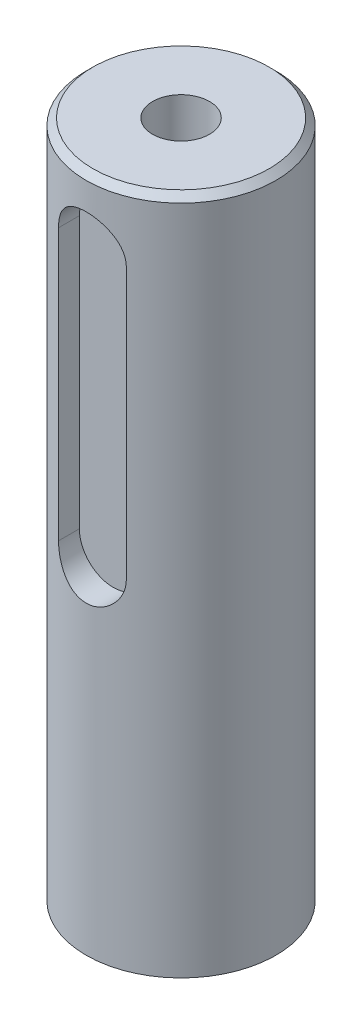
ISO-10303-21;
HEADER;
FILE_DESCRIPTION(('STEP AP214'),'2;1');
FILE_NAME('part.step','',(''),(''),'','','');
FILE_SCHEMA(('AUTOMOTIVE_DESIGN { 1 0 10303 214 1 1 1 1 }'));
ENDSEC;
DATA;
#1=APPLICATION_CONTEXT('core data for automotive mechanical design processes');
#2=APPLICATION_PROTOCOL_DEFINITION('international standard','automotive_design',2000,#1);
#3=PRODUCT_CONTEXT('',#1,'mechanical');
#4=PRODUCT('Part','Part','',(#3));
#5=PRODUCT_RELATED_PRODUCT_CATEGORY('part','',(#4));
#6=PRODUCT_DEFINITION_FORMATION('','',#4);
#7=PRODUCT_DEFINITION_CONTEXT('part definition',#1,'design');
#8=PRODUCT_DEFINITION('design','',#6,#7);
#9=PRODUCT_DEFINITION_SHAPE('','',#8);
#10=(LENGTH_UNIT() NAMED_UNIT(*) SI_UNIT(.MILLI.,.METRE.));
#11=(NAMED_UNIT(*) PLANE_ANGLE_UNIT() SI_UNIT($,.RADIAN.));
#12=(NAMED_UNIT(*) SI_UNIT($,.STERADIAN.) SOLID_ANGLE_UNIT());
#13=UNCERTAINTY_MEASURE_WITH_UNIT(LENGTH_MEASURE(1.E-05),#10,'distance_accuracy_value','');
#14=(GEOMETRIC_REPRESENTATION_CONTEXT(3) GLOBAL_UNCERTAINTY_ASSIGNED_CONTEXT((#13)) GLOBAL_UNIT_ASSIGNED_CONTEXT((#10,
#11,#12)) REPRESENTATION_CONTEXT('',''));
#15=CARTESIAN_POINT('',(0.,0.,0.));
#16=DIRECTION('',(0.,0.,1.));
#17=DIRECTION('',(1.,0.,0.));
#18=AXIS2_PLACEMENT_3D('',#15,#16,#17);
#19=CARTESIAN_POINT('',(0.,45.,5.));
#20=DIRECTION('',(0.,0.,1.));
#21=DIRECTION('',(1.,0.,0.));
#22=AXIS2_PLACEMENT_3D('',#19,#20,#21);
#23=PLANE('',#22);
#24=CARTESIAN_POINT('',(0.,45.,5.));
#25=DIRECTION('',(0.,0.,1.));
#26=DIRECTION('',(1.,0.,0.));
#27=AXIS2_PLACEMENT_3D('',#24,#25,#26);
#28=CIRCLE('',#27,2.5);
#29=CARTESIAN_POINT('',(2.5,45.,5.));
#30=VERTEX_POINT('',#29);
#31=CARTESIAN_POINT('',(-2.5,45.,5.));
#32=VERTEX_POINT('',#31);
#33=EDGE_CURVE('E124',#30,#32,#28,.T.);
#34=ORIENTED_EDGE('',*,*,#33,.T.);
#35=DIRECTION('',(0.,-1.,0.));
#36=VECTOR('',#35,1.);
#37=CARTESIAN_POINT('',(-2.5,45.,5.));
#38=LINE('',#37,#36);
#39=CARTESIAN_POINT('',(-2.5,25.,5.));
#40=VERTEX_POINT('',#39);
#41=EDGE_CURVE('E11',#32,#40,#38,.T.);
#42=ORIENTED_EDGE('',*,*,#41,.T.);
#43=CARTESIAN_POINT('',(0.,25.,5.));
#44=DIRECTION('',(0.,0.,1.));
#45=DIRECTION('',(1.,0.,0.));
#46=AXIS2_PLACEMENT_3D('',#43,#44,#45);
#47=CIRCLE('',#46,2.5);
#48=CARTESIAN_POINT('',(2.5,25.,5.));
#49=VERTEX_POINT('',#48);
#50=EDGE_CURVE('E121',#40,#49,#47,.T.);
#51=ORIENTED_EDGE('',*,*,#50,.T.);
#52=DIRECTION('',(0.,1.,0.));
#53=VECTOR('',#52,1.);
#54=CARTESIAN_POINT('',(2.5,45.,5.));
#55=LINE('',#54,#53);
#56=EDGE_CURVE('E114',#49,#30,#55,.T.);
#57=ORIENTED_EDGE('',*,*,#56,.T.);
#58=EDGE_LOOP('',(#34,#42,#51,#57));
#59=FACE_BOUND('',#58,.T.);
#60=ADVANCED_FACE('F17',(#59),#23,.T.);
#61=CARTESIAN_POINT('',(-2.5,45.,5.));
#62=DIRECTION('',(-1.,0.,0.));
#63=DIRECTION('',(0.,1.,0.));
#64=AXIS2_PLACEMENT_3D('',#61,#62,#63);
#65=PLANE('',#64);
#66=DIRECTION('',(0.,0.,1.));
#67=VECTOR('',#66,1.);
#68=CARTESIAN_POINT('',(-2.5,25.,5.));
#69=LINE('',#68,#67);
#70=CARTESIAN_POINT('',(-2.5,25.,6.53834841531101));
#71=VERTEX_POINT('',#70);
#72=EDGE_CURVE('E26',#40,#71,#69,.T.);
#73=ORIENTED_EDGE('',*,*,#72,.F.);
#74=ORIENTED_EDGE('',*,*,#41,.F.);
#75=DIRECTION('',(0.,0.,1.));
#76=VECTOR('',#75,1.);
#77=CARTESIAN_POINT('',(-2.5,45.,5.));
#78=LINE('',#77,#76);
#79=CARTESIAN_POINT('',(-2.5,45.,6.53834841531101));
#80=VERTEX_POINT('',#79);
#81=EDGE_CURVE('E113',#32,#80,#78,.T.);
#82=ORIENTED_EDGE('',*,*,#81,.T.);
#83=DIRECTION('',(0.,1.,0.));
#84=VECTOR('',#83,1.);
#85=CARTESIAN_POINT('',(-2.5,50.,6.53834841531101));
#86=LINE('',#85,#84);
#87=EDGE_CURVE('E213',#71,#80,#86,.T.);
#88=ORIENTED_EDGE('',*,*,#87,.F.);
#89=EDGE_LOOP('',(#73,#74,#82,#88));
#90=FACE_BOUND('',#89,.T.);
#91=ADVANCED_FACE('F181',(#90),#65,.F.);
#92=CARTESIAN_POINT('',(0.,25.,5.));
#93=DIRECTION('',(0.,0.,1.));
#94=DIRECTION('',(1.,0.,0.));
#95=AXIS2_PLACEMENT_3D('',#92,#93,#94);
#96=CYLINDRICAL_SURFACE('',#95,2.5);
#97=DIRECTION('',(0.,0.,1.));
#98=VECTOR('',#97,1.);
#99=CARTESIAN_POINT('',(2.5,25.,5.));
#100=LINE('',#99,#98);
#101=CARTESIAN_POINT('',(2.5,25.,6.53834841531101));
#102=VERTEX_POINT('',#101);
#103=EDGE_CURVE('E117',#49,#102,#100,.T.);
#104=ORIENTED_EDGE('',*,*,#103,.F.);
#105=ORIENTED_EDGE('',*,*,#50,.F.);
#106=ORIENTED_EDGE('',*,*,#72,.T.);
#107=CARTESIAN_POINT('',(2.50000000000001,25.,6.53834841531101));
#108=CARTESIAN_POINT('',(2.4999942053684,24.9632451868886,6.53834990578781));
#109=CARTESIAN_POINT('',(2.49920313362496,24.9264892760574,6.53865307494976));
#110=CARTESIAN_POINT('',(2.49603827401008,24.8532586189123,6.53986225560212));
#111=CARTESIAN_POINT('',(2.49367322415535,24.816783438769,6.54076493880431));
#112=CARTESIAN_POINT('',(2.48735926537411,24.7441139340619,6.54316854249251));
#113=CARTESIAN_POINT('',(2.48341572883347,24.7079190770875,6.54466743367497));
#114=CARTESIAN_POINT('',(2.47394566722532,24.6358104413741,6.54825309569914));
#115=CARTESIAN_POINT('',(2.46842104061933,24.5998963782924,6.55033916145382));
#116=CARTESIAN_POINT('',(2.45578767297576,24.5283489992731,6.55508599551257));
#117=CARTESIAN_POINT('',(2.44867734708483,24.4927160014013,6.55774733870485));
#118=CARTESIAN_POINT('',(2.43287039003856,24.4217299883881,6.56362803473649));
#119=CARTESIAN_POINT('',(2.42416876274519,24.3863782316906,6.56684914341641));
#120=CARTESIAN_POINT('',(2.40517595689165,24.3159541111376,6.57382928584817));
#121=CARTESIAN_POINT('',(2.39487652373537,24.2808842536957,6.57759110515465));
#122=CARTESIAN_POINT('',(2.37268266524857,24.2110210715879,6.58562960204764));
#123=CARTESIAN_POINT('',(2.3607769430393,24.1762317457059,6.58990990202835));
#124=CARTESIAN_POINT('',(2.34176576466532,24.1243838034444,6.59667936986742));
#125=CARTESIAN_POINT('',(2.33521226199007,24.1070987928692,6.59900255564235));
#126=CARTESIAN_POINT('',(2.32170230305977,24.0725979491492,6.60376786329772));
#127=CARTESIAN_POINT('',(2.31474393190281,24.0553829406993,6.6062105399069));
#128=CARTESIAN_POINT('',(2.30061694315071,24.0214831599696,6.61114335632076));
#129=CARTESIAN_POINT('',(2.29345595147082,24.0047949002221,6.61363137971569));
#130=CARTESIAN_POINT('',(2.27880626448187,23.9716267129114,6.61869336800113));
#131=CARTESIAN_POINT('',(2.27131842582891,23.9551463713556,6.62126710447926));
#132=CARTESIAN_POINT('',(2.24838085630809,23.9060600330353,6.62910584643043));
#133=CARTESIAN_POINT('',(2.23241723106354,23.8737130448697,6.63450233812317));
#134=CARTESIAN_POINT('',(2.19916441063923,23.809853836666,6.64559872153457));
#135=CARTESIAN_POINT('',(2.18187817533287,23.7783399534114,6.65129792753864));
#136=CARTESIAN_POINT('',(2.14597325724883,23.7161442659798,6.66296893089396));
#137=CARTESIAN_POINT('',(2.12735495703699,23.6854622263624,6.66894064980313));
#138=CARTESIAN_POINT('',(2.08877968261624,23.6249290970618,6.68112334634432));
#139=CARTESIAN_POINT('',(2.06882060062884,23.5950794253016,6.68733469383676));
#140=CARTESIAN_POINT('',(2.02755686040564,23.5362094075538,6.69996121317379));
#141=CARTESIAN_POINT('',(2.00624774608146,23.5071923221786,6.70637702112704));
#142=CARTESIAN_POINT('',(1.96227773104356,23.4499849729261,6.71937456127739));
#143=CARTESIAN_POINT('',(1.93961022061412,23.4217999505205,6.72595699645699));
#144=CARTESIAN_POINT('',(1.89291401829371,23.3662572066919,6.73924846001466));
#145=CARTESIAN_POINT('',(1.86887677354068,23.3389068167453,6.74595805637115));
#146=CARTESIAN_POINT('',(1.81944317862265,23.2850218886881,6.75945922653562));
#147=CARTESIAN_POINT('',(1.79403668491979,23.2584967103887,6.76625100040604));
#148=CARTESIAN_POINT('',(1.74266806907067,23.2071401980064,6.77966055342404));
#149=CARTESIAN_POINT('',(1.7167305546297,23.1822844102044,6.78627886672337));
#150=CARTESIAN_POINT('',(1.66377333985663,23.1337174848513,6.79945605705526));
#151=CARTESIAN_POINT('',(1.63675325911545,23.1100067562391,6.80601491218392));
#152=CARTESIAN_POINT('',(1.57472395038312,23.0579141987115,6.82066720053683));
#153=CARTESIAN_POINT('',(1.53942368075181,23.0298691634399,6.82872884146147));
#154=CARTESIAN_POINT('',(1.46713237841029,22.9755480391484,6.84462556398891));
#155=CARTESIAN_POINT('',(1.43013331097226,22.949282215965,6.85245920286764));
#156=CARTESIAN_POINT('',(1.36975966135517,22.9087877404337,6.86471373092684));
#157=CARTESIAN_POINT('',(1.3468271991852,22.8939310720166,6.86925132535249));
#158=CARTESIAN_POINT('',(1.30058512101441,22.865026544869,6.87815599463448));
#159=CARTESIAN_POINT('',(1.27727789966077,22.8509750841055,6.88252379524779));
#160=CARTESIAN_POINT('',(1.22248816075744,22.8191500382709,6.89249819997907));
#161=CARTESIAN_POINT('',(1.19082690911042,22.8016636601022,6.89804230594667));
#162=CARTESIAN_POINT('',(1.1268374785564,22.7681284474776,6.90878324522085));
#163=CARTESIAN_POINT('',(1.09451201851054,22.7520748006152,6.91398122494331));
#164=CARTESIAN_POINT('',(1.04551307448734,22.7290623311353,6.92150092754061));
#165=CARTESIAN_POINT('',(1.02910703364032,22.7215745453623,6.9239596033762));
#166=CARTESIAN_POINT('',(0.996129228848222,22.7069587386548,6.92878085045466));
#167=CARTESIAN_POINT('',(0.979557534238929,22.6998305741786,6.93114345996783));
#168=CARTESIAN_POINT('',(0.945880963821964,22.6857694271366,6.93582040138964));
#169=CARTESIAN_POINT('',(0.928772457576867,22.6788443878791,6.9381324680328));
#170=CARTESIAN_POINT('',(0.894472164147947,22.6653886022144,6.9426376494463));
#171=CARTESIAN_POINT('',(0.877281052527923,22.6588562867665,6.94483123344068));
#172=CARTESIAN_POINT('',(0.825674729516835,22.6398882414271,6.95121990221103));
#173=CARTESIAN_POINT('',(0.791034991083342,22.628001388799,6.95524956043319));
#174=CARTESIAN_POINT('',(0.721427343515071,22.6058166942804,6.9628127231092));
#175=CARTESIAN_POINT('',(0.686462611415649,22.5955098223423,6.96634903585939));
#176=CARTESIAN_POINT('',(0.616211333356984,22.5764823364229,6.97291352051249));
#177=CARTESIAN_POINT('',(0.580926692621567,22.5677553969054,6.97594371479588));
#178=CARTESIAN_POINT('',(0.510044402958375,22.5518850502388,6.98148377291639));
#179=CARTESIAN_POINT('',(0.474447611644306,22.5447382074387,6.98399476488436));
#180=CARTESIAN_POINT('',(0.402949343232388,22.532025096323,6.98848442041703));
#181=CARTESIAN_POINT('',(0.367047949924225,22.5264584069862,6.99046322577187));
#182=CARTESIAN_POINT('',(0.294949074659556,22.5169025479277,6.99387658499675));
#183=CARTESIAN_POINT('',(0.258751198425576,22.5129160275982,6.99531022465188));
#184=CARTESIAN_POINT('',(0.186067941519873,22.506517459205,6.99762141777651));
#185=CARTESIAN_POINT('',(0.149581995218523,22.504111115488,6.99849695620324));
#186=CARTESIAN_POINT('',(0.0763314770789259,22.5008697274737,6.99968018024208));
#187=CARTESIAN_POINT('',(0.0395664733017269,22.5000433561473,6.99998473134715));
#188=CARTESIAN_POINT('',(-0.0340379324628648,22.4999596986197,7.0000141772405));
#189=CARTESIAN_POINT('',(-0.0708773384834085,22.5007055033726,6.99973793016176));
#190=CARTESIAN_POINT('',(-0.144280046949055,22.5037935651964,6.99860866291151));
#191=CARTESIAN_POINT('',(-0.180843761468014,22.5061271191141,6.99775878725327));
#192=CARTESIAN_POINT('',(-0.253685880189502,22.5123876385761,6.99549615959138));
#193=CARTESIAN_POINT('',(-0.28996483675517,22.5163088986184,6.99408542339357));
#194=CARTESIAN_POINT('',(-0.362229114688752,22.5257418082337,6.99071500611608));
#195=CARTESIAN_POINT('',(-0.398214820410277,22.5312508356436,6.98875623026657));
#196=CARTESIAN_POINT('',(-0.469884884358848,22.5438561372229,6.98430366736193));
#197=CARTESIAN_POINT('',(-0.505569148733395,22.5509528880984,6.98180971963338));
#198=CARTESIAN_POINT('',(-0.576629464637365,22.5667305803877,6.9763006885716));
#199=CARTESIAN_POINT('',(-0.612004644997349,22.5754150404934,6.97328444853131));
#200=CARTESIAN_POINT('',(-0.682440064670265,22.59436492371,6.96674470911583));
#201=CARTESIAN_POINT('',(-0.717498378919627,22.6046367800709,6.96321914958762));
#202=CARTESIAN_POINT('',(-0.787295969509085,22.6267593209728,6.9556742695174));
#203=CARTESIAN_POINT('',(-0.822032038915548,22.6386191687855,6.95165209469288));
#204=CARTESIAN_POINT('',(-0.873784344807093,22.6575508211449,6.94527216902504));
#205=CARTESIAN_POINT('',(-0.89102490917601,22.6640718330751,6.9430810331789));
#206=CARTESIAN_POINT('',(-0.925423910287565,22.6775091089159,6.93858002346694));
#207=CARTESIAN_POINT('',(-0.942581661863298,22.6844269712231,6.93626967383281));
#208=CARTESIAN_POINT('',(-0.976582827926108,22.698560181785,6.93156388748302));
#209=CARTESIAN_POINT('',(-0.993427679729989,22.7057723815559,6.92916937691395));
#210=CARTESIAN_POINT('',(-1.02689505891115,22.7205263800205,6.92428853200411));
#211=CARTESIAN_POINT('',(-1.0435181144498,22.728067084995,6.92180250608443));
#212=CARTESIAN_POINT('',(-1.09299416999279,22.7511565151947,6.91422258811145));
#213=CARTESIAN_POINT('',(-1.12558452565198,22.7672267513015,6.90898873963912));
#214=CARTESIAN_POINT('',(-1.18987221324814,22.8006886969481,6.89820721401872));
#215=CARTESIAN_POINT('',(-1.22157234706622,22.8180754204488,6.89266073949015));
#216=CARTESIAN_POINT('',(-1.28408205451917,22.8541684725313,6.88128916688365));
#217=CARTESIAN_POINT('',(-1.31489315449668,22.872872323047,6.8754645983338));
#218=CARTESIAN_POINT('',(-1.37562631942232,22.911596918939,6.86357121064709));
#219=CARTESIAN_POINT('',(-1.40554841100883,22.9316176247989,6.85750239884162));
#220=CARTESIAN_POINT('',(-1.46450652718747,22.9729735471482,6.84515371793891));
#221=CARTESIAN_POINT('',(-1.49354088256943,22.9943110365325,6.83887349292153));
#222=CARTESIAN_POINT('',(-1.55072716194945,23.0382982195392,6.82613408426207));
#223=CARTESIAN_POINT('',(-1.57887556732582,23.0609523239787,6.81967434198759));
#224=CARTESIAN_POINT('',(-1.63429441127469,23.1075706571142,6.8066068349016));
#225=CARTESIAN_POINT('',(-1.66155937672959,23.1315412196497,6.79999846505501));
#226=CARTESIAN_POINT('',(-1.71521615445298,23.1807905477308,6.78666363614255));
#227=CARTESIAN_POINT('',(-1.74160048283699,23.2060773238733,6.77993667353797));
#228=CARTESIAN_POINT('',(-1.79339948404889,23.2578549024041,6.76641985675459));
#229=CARTESIAN_POINT('',(-1.81880903519017,23.2843507904195,6.75962985558035));
#230=CARTESIAN_POINT('',(-1.86824387145844,23.3381860626267,6.74613339242338));
#231=CARTESIAN_POINT('',(-1.89227929580038,23.3655160761098,6.73942671829888));
#232=CARTESIAN_POINT('',(-1.93897600989177,23.421017438354,6.72613984280947));
#233=CARTESIAN_POINT('',(-1.96164577103634,23.4491815229409,6.71955908381945));
#234=CARTESIAN_POINT('',(-2.0056220279031,23.5063488941906,6.70656419229796));
#235=CARTESIAN_POINT('',(-2.02693506738364,23.5353469872158,6.7001493653678));
#236=CARTESIAN_POINT('',(-2.06820900978682,23.5941802524802,6.68752388252566));
#237=CARTESIAN_POINT('',(-2.08817430048011,23.6240122117869,6.68131260168553));
#238=CARTESIAN_POINT('',(-2.12676415569106,23.6845113291818,6.66912910679453));
#239=CARTESIAN_POINT('',(-2.14539076223009,23.7151771124318,6.66315653507401));
#240=CARTESIAN_POINT('',(-2.18131447832695,23.777341659344,6.65148284274639));
#241=CARTESIAN_POINT('',(-2.19861114286688,23.8088406971275,6.64578181324198));
#242=CARTESIAN_POINT('',(-2.23188698523731,23.872671596155,6.63468076675631));
#243=CARTESIAN_POINT('',(-2.24786314542968,23.9050051547898,6.62928144789223));
#244=CARTESIAN_POINT('',(-2.27082084177093,23.9540719177399,6.62143778040183));
#245=CARTESIAN_POINT('',(-2.27831573124143,23.9705460848323,6.61886224632219));
#246=CARTESIAN_POINT('',(-2.29298008520022,24.0037022555437,6.61379638900334));
#247=CARTESIAN_POINT('',(-2.30014868705343,24.0203846765607,6.61130629549097));
#248=CARTESIAN_POINT('',(-2.31430045316372,24.0542947539932,6.60636593378909));
#249=CARTESIAN_POINT('',(-2.32127553137741,24.071526113366,6.6039179074685));
#250=CARTESIAN_POINT('',(-2.33481787580356,24.1060601609896,6.59914212363867));
#251=CARTESIAN_POINT('',(-2.34138706236419,24.1233620210863,6.59681381022637));
#252=CARTESIAN_POINT('',(-2.36044373718647,24.1752611351446,6.5900293255147));
#253=CARTESIAN_POINT('',(-2.37237795043707,24.2100856270111,6.58573942787273));
#254=CARTESIAN_POINT('',(-2.39462488771872,24.2800210821755,6.57768276956566));
#255=CARTESIAN_POINT('',(-2.4049489288505,24.3151280343423,6.5739123816373));
#256=CARTESIAN_POINT('',(-2.42398711277142,24.3856282772146,6.56691623410647));
#257=CARTESIAN_POINT('',(-2.43270951381655,24.4210190572347,6.56368768857097));
#258=CARTESIAN_POINT('',(-2.44855422539321,24.4920850415114,6.55779333716841));
#259=CARTESIAN_POINT('',(-2.4556815182717,24.5277589892588,6.55512578066361));
#260=CARTESIAN_POINT('',(-2.46834507195208,24.5993901866709,6.5503678055644));
#261=CARTESIAN_POINT('',(-2.47388288597106,24.6353471242478,6.54827682362826));
#262=CARTESIAN_POINT('',(-2.48337561384166,24.7075434244822,6.54468266480159));
#263=CARTESIAN_POINT('',(-2.487328580042,24.7437830791876,6.54318021121713));
#264=CARTESIAN_POINT('',(-2.49365771977649,24.816544091564,6.54077085433794));
#265=CARTESIAN_POINT('',(-2.49602845507989,24.8530659887723,6.53986600515839));
#266=CARTESIAN_POINT('',(-2.49920104246354,24.9263920011577,6.53865387434532));
#267=CARTESIAN_POINT('',(-2.4999940757067,24.9631965546839,6.538349951752));
#268=CARTESIAN_POINT('',(-2.5,25.,6.53834841531101));
#269=B_SPLINE_CURVE_WITH_KNOTS('',3,(#107,#108,#109,#110,#111,#112,#113,#114,#115,#116,#117,
#118,#119,#120,#121,#122,#123,#124,#125,#126,#127,#128,#129,#130,#131,#132,#133,#134,#135,#136,
#137,#138,#139,#140,#141,#142,#143,#144,#145,#146,#147,#148,#149,#150,#151,#152,#153,#154,#155,
#156,#157,#158,#159,#160,#161,#162,#163,#164,#165,#166,#167,#168,#169,#170,#171,#172,#173,#174,
#175,#176,#177,#178,#179,#180,#181,#182,#183,#184,#185,#186,#187,#188,#189,#190,#191,#192,#193,
#194,#195,#196,#197,#198,#199,#200,#201,#202,#203,#204,#205,#206,#207,#208,#209,#210,#211,#212,
#213,#214,#215,#216,#217,#218,#219,#220,#221,#222,#223,#224,#225,#226,#227,#228,#229,#230,#231,
#232,#233,#234,#235,#236,#237,#238,#239,#240,#241,#242,#243,#244,#245,#246,#247,#248,#249,#250,
#251,#252,#253,#254,#255,#256,#257,#258,#259,#260,#261,#262,#263,#264,#265,#266,#267,#268),
.UNSPECIFIED.,.F.,.F.,(4,2,2,2,2,2,2,2,2,2,2,2,2,2,2,2,2,2,2,2,2,2,2,2,2,2,2,2,2,2,2,2,2,2,2,2,
2,2,2,2,2,2,2,2,2,2,2,2,2,2,2,2,2,2,2,2,2,2,2,2,2,2,2,2,2,2,2,2,2,2,2,2,2,2,2,2,2,2,2,2,4),(0.,
0.110256661526958,0.219906277618954,0.329185831594615,0.438334716983879,0.547593185868377,
0.657200769248212,0.767394720909463,0.878408534501739,0.934297995185296,0.990477538628972,
1.04546148671562,1.10030908851654,1.20969082544793,1.31883455980636,1.42794707320952,
1.53723532379152,1.64690527404181,1.75716074657688,1.86820233895241,1.98022642489368,
2.0897801526744,2.1993727207285,2.33670539649944,2.47477275264668,2.55785560452216,
2.64053190478172,2.75027104730581,2.85962650236636,2.91422520300751,2.96880193549686,
3.02460061452926,3.08015908823818,3.19064873103491,3.30048124607221,3.40986380345529,
3.5190061355899,3.62811936012963,3.73741476339232,3.84710257892405,3.95739079621123,
4.06789604625371,4.177800396943,4.28731325728322,4.39664628581362,4.50601218518778,
4.61562346671037,4.72569122040418,4.8364239258108,4.89210727999914,4.94803325889368,
5.00346777120613,5.05873004363596,5.1688276583186,5.27852735411609,5.38802590594478,
5.49752117342778,5.60721103422235,5.71729231686487,5.82795976165633,5.93940503638432,
6.05137240793392,6.16236336250238,6.27257414906893,6.38220520728942,6.49146016843044,
6.60054477079038,6.70966571701161,6.81902950435917,6.87386984480371,6.92884762298321,
6.98509295975993,7.04104777682284,7.15219140347465,7.26251475170969,7.37225222461496,
7.48164199236369,7.59092449913245,7.70034089671442,7.81013145501195,7.92053400133184),.UNSPECIFIED.);
#270=EDGE_CURVE('E166',#102,#71,#269,.T.);
#271=ORIENTED_EDGE('',*,*,#270,.F.);
#272=EDGE_LOOP('',(#104,#105,#106,#271));
#273=FACE_BOUND('',#272,.T.);
#274=ADVANCED_FACE('F171',(#273),#96,.F.);
#275=CARTESIAN_POINT('',(2.5,45.,5.));
#276=DIRECTION('',(1.,0.,0.));
#277=DIRECTION('',(0.,1.,0.));
#278=AXIS2_PLACEMENT_3D('',#275,#276,#277);
#279=PLANE('',#278);
#280=DIRECTION('',(0.,0.,1.));
#281=VECTOR('',#280,1.);
#282=CARTESIAN_POINT('',(2.5,45.,5.));
#283=LINE('',#282,#281);
#284=CARTESIAN_POINT('',(2.5,45.,6.53834841531101));
#285=VERTEX_POINT('',#284);
#286=EDGE_CURVE('E118',#30,#285,#283,.T.);
#287=ORIENTED_EDGE('',*,*,#286,.F.);
#288=ORIENTED_EDGE('',*,*,#56,.F.);
#289=ORIENTED_EDGE('',*,*,#103,.T.);
#290=DIRECTION('',(0.,-1.,0.));
#291=VECTOR('',#290,1.);
#292=CARTESIAN_POINT('',(2.5,50.,6.53834841531101));
#293=LINE('',#292,#291);
#294=EDGE_CURVE('E102',#285,#102,#293,.T.);
#295=ORIENTED_EDGE('',*,*,#294,.F.);
#296=EDGE_LOOP('',(#287,#288,#289,#295));
#297=FACE_BOUND('',#296,.T.);
#298=ADVANCED_FACE('F180',(#297),#279,.F.);
#299=CARTESIAN_POINT('',(0.,45.,5.));
#300=DIRECTION('',(0.,0.,1.));
#301=DIRECTION('',(1.,0.,0.));
#302=AXIS2_PLACEMENT_3D('',#299,#300,#301);
#303=CYLINDRICAL_SURFACE('',#302,2.5);
#304=ORIENTED_EDGE('',*,*,#81,.F.);
#305=ORIENTED_EDGE('',*,*,#33,.F.);
#306=ORIENTED_EDGE('',*,*,#286,.T.);
#307=CARTESIAN_POINT('',(-2.5,45.,6.53834841531101));
#308=CARTESIAN_POINT('',(-2.49999420536838,45.0367548131066,6.53834990578782));
#309=CARTESIAN_POINT('',(-2.49920313362492,45.073510723933,6.53865307494978));
#310=CARTESIAN_POINT('',(-2.49603827401004,45.1467413810698,6.53986225560213));
#311=CARTESIAN_POINT('',(-2.4936732241553,45.1832165612095,6.54076493880434));
#312=CARTESIAN_POINT('',(-2.48735926537406,45.2558860659105,6.54316854249253));
#313=CARTESIAN_POINT('',(-2.4834157288334,45.2920809228826,6.544667433675));
#314=CARTESIAN_POINT('',(-2.47394566722526,45.3641895585923,6.54825309569917));
#315=CARTESIAN_POINT('',(-2.46842104061923,45.4001036216729,6.55033916145385));
#316=CARTESIAN_POINT('',(-2.45578767297567,45.4716510006909,6.55508599551261));
#317=CARTESIAN_POINT('',(-2.44867734708471,45.5072839985628,6.5577473387049));
#318=CARTESIAN_POINT('',(-2.43287039003844,45.5782700115772,6.56362803473653));
#319=CARTESIAN_POINT('',(-2.42416876274505,45.6136217682759,6.56684914341646));
#320=CARTESIAN_POINT('',(-2.40517595689151,45.6840458888325,6.57382928584823));
#321=CARTESIAN_POINT('',(-2.39487652373521,45.7191157462767,6.57759110515471));
#322=CARTESIAN_POINT('',(-2.37268266524842,45.7889789283905,6.5856296020477));
#323=CARTESIAN_POINT('',(-2.36077694303914,45.823768254276,6.58990990202841));
#324=CARTESIAN_POINT('',(-2.34176576466526,45.8756161965434,6.59667936986744));
#325=CARTESIAN_POINT('',(-2.33521226199,45.8929012071209,6.59900255564238));
#326=CARTESIAN_POINT('',(-2.32170230305975,45.9274020508457,6.60376786329773));
#327=CARTESIAN_POINT('',(-2.31474393190285,45.9446170592981,6.60621053990689));
#328=CARTESIAN_POINT('',(-2.30061694315477,45.978516840023,6.61114335631934));
#329=CARTESIAN_POINT('',(-2.29345595147905,45.9952050997631,6.61363137971283));
#330=CARTESIAN_POINT('',(-2.2788062644979,46.02837328706,6.61869336799561));
#331=CARTESIAN_POINT('',(-2.27131842584856,46.0448536286093,6.62126710447252));
#332=CARTESIAN_POINT('',(-2.24838085633729,46.0939399669126,6.62910584642052));
#333=CARTESIAN_POINT('',(-2.23241723109853,46.1262869550678,6.63450233811138));
#334=CARTESIAN_POINT('',(-2.19916441068401,46.1901461632542,6.64559872151974));
#335=CARTESIAN_POINT('',(-2.1818781753815,46.2216600465018,6.65129792752268));
#336=CARTESIAN_POINT('',(-2.1459732573034,46.2838557339229,6.66296893087638));
#337=CARTESIAN_POINT('',(-2.12735495709349,46.3145377735368,6.6689406497851));
#338=CARTESIAN_POINT('',(-2.0887796826748,46.3750709028339,6.68112334632601));
#339=CARTESIAN_POINT('',(-2.06882060068739,46.4049205745941,6.68733469381864));
#340=CARTESIAN_POINT('',(-2.02755686046235,46.4637905923454,6.69996121315664));
#341=CARTESIAN_POINT('',(-2.00624774613619,46.4928076777239,6.70637702111067));
#342=CARTESIAN_POINT('',(-1.96227773109253,46.5500150269869,6.7193745612631));
#343=CARTESIAN_POINT('',(-1.93961022065918,46.5782000493994,6.72595699644401));
#344=CARTESIAN_POINT('',(-1.89291401832894,46.6337427932453,6.73924846000479));
#345=CARTESIAN_POINT('',(-1.86887677356987,46.6610931832021,6.74595805636308));
#346=CARTESIAN_POINT('',(-1.81944317863837,46.714978111284,6.75945922653142));
#347=CARTESIAN_POINT('',(-1.79403668492798,46.7415032895976,6.7662510004039));
#348=CARTESIAN_POINT('',(-1.74266806908032,46.7928598019893,6.77966055342152));
#349=CARTESIAN_POINT('',(-1.71673055464912,46.8177155897873,6.78627886671842));
#350=CARTESIAN_POINT('',(-1.66377333988989,46.8662825151346,6.79945605704711));
#351=CARTESIAN_POINT('',(-1.63675325915261,46.8899932437446,6.80601491217497));
#352=CARTESIAN_POINT('',(-1.57472395042203,46.9420858012718,6.82066720052786));
#353=CARTESIAN_POINT('',(-1.53942368078809,46.9701308365444,6.82872884145331));
#354=CARTESIAN_POINT('',(-1.46713237843299,47.0244519608423,6.84462556398411));
#355=CARTESIAN_POINT('',(-1.43013331098371,47.0507177840305,6.85245920286532));
#356=CARTESIAN_POINT('',(-1.3697596613582,47.0912122595623,6.86471373092622));
#357=CARTESIAN_POINT('',(-1.34682719919141,47.1060689279756,6.86925132535127));
#358=CARTESIAN_POINT('',(-1.30058512102576,47.1349734551171,6.87815599463233));
#359=CARTESIAN_POINT('',(-1.27727789967404,47.1490249158783,6.88252379524532));
#360=CARTESIAN_POINT('',(-1.22248816077311,47.1808499617097,6.89249819997629));
#361=CARTESIAN_POINT('',(-1.19082690912664,47.1983363398777,6.89804230594387));
#362=CARTESIAN_POINT('',(-1.12683747857154,47.2318715525036,6.90878324521838));
#363=CARTESIAN_POINT('',(-1.09451201852398,47.2479251993679,6.91398122494119));
#364=CARTESIAN_POINT('',(-1.04551307449757,47.2709376688524,6.92150092753907));
#365=CARTESIAN_POINT('',(-1.02910703364882,47.2784254546274,6.92395960337494));
#366=CARTESIAN_POINT('',(-0.996129228852752,47.2930412613397,6.92878085045402));
#367=CARTESIAN_POINT('',(-0.979557534241203,47.3001694258186,6.93114345996751));
#368=CARTESIAN_POINT('',(-0.945880963826496,47.3142305728633,6.93582040138901));
#369=CARTESIAN_POINT('',(-0.92877245758598,47.321155612121,6.93813246803157));
#370=CARTESIAN_POINT('',(-0.894472164165649,47.3346113977856,6.94263764944401));
#371=CARTESIAN_POINT('',(-0.877281052549631,47.3411437132335,6.94483123343793));
#372=CARTESIAN_POINT('',(-0.825674729549104,47.3601117585731,6.95121990220717));
#373=CARTESIAN_POINT('',(-0.791034991122042,47.3719986112012,6.95524956042875));
#374=CARTESIAN_POINT('',(-0.721427343564526,47.3941833057198,6.96281272310406));
#375=CARTESIAN_POINT('',(-0.686462611469401,47.4044901776579,6.96634903585407));
#376=CARTESIAN_POINT('',(-0.616211333417217,47.4235176635773,6.97291352050716));
#377=CARTESIAN_POINT('',(-0.580926692683957,47.4322446030947,6.97594371479067));
#378=CARTESIAN_POINT('',(-0.510044403022954,47.4481149497613,6.98148377291167));
#379=CARTESIAN_POINT('',(-0.474447611708893,47.4552617925614,6.98399476487997));
#380=CARTESIAN_POINT('',(-0.402949343294854,47.4679749036771,6.98848442041344));
#381=CARTESIAN_POINT('',(-0.367047949984544,47.4735415930138,6.99046322576872));
#382=CARTESIAN_POINT('',(-0.294949074713432,47.4830974520724,6.9938765849945));
#383=CARTESIAN_POINT('',(-0.258751198475143,47.4870839724019,6.99531022465007));
#384=CARTESIAN_POINT('',(-0.186067941558672,47.493482540795,6.99762141777551));
#385=CARTESIAN_POINT('',(-0.149581995250853,47.4958888845119,6.99849695620259));
#386=CARTESIAN_POINT('',(-0.0763314770961654,47.4991302725264,6.99968018024194));
#387=CARTESIAN_POINT('',(-0.0395664733103401,47.499956643853,6.99998473134715));
#388=CARTESIAN_POINT('',(0.03403793245436,47.50004030138,7.0000141772405));
#389=CARTESIAN_POINT('',(0.0708773384663848,47.4992944966273,6.99973793016189));
#390=CARTESIAN_POINT('',(0.14428004691713,47.4962064348036,6.99860866291213));
#391=CARTESIAN_POINT('',(0.180843761429702,47.4938728808858,6.99775878725423));
#392=CARTESIAN_POINT('',(0.253685880140559,47.4876123614237,6.99549615959313));
#393=CARTESIAN_POINT('',(0.289964836701974,47.4836911013814,6.99408542339576));
#394=CARTESIAN_POINT('',(0.362229114629196,47.4742581917661,6.99071500611915));
#395=CARTESIAN_POINT('',(0.398214820348599,47.4687491643562,6.98875623027007));
#396=CARTESIAN_POINT('',(0.469884884295077,47.4561438627768,6.98430366736622));
#397=CARTESIAN_POINT('',(0.505569148669634,47.4490471119013,6.98180971963799));
#398=CARTESIAN_POINT('',(0.576629464575767,47.433269419612,6.9763006885767));
#399=CARTESIAN_POINT('',(0.612004644937883,47.4245849595062,6.97328444853654));
#400=CARTESIAN_POINT('',(0.6824400646172,47.4056350762897,6.96674470912105));
#401=CARTESIAN_POINT('',(0.717498378870805,47.3953632199288,6.96321914959268));
#402=CARTESIAN_POINT('',(0.787295969470889,47.3732406790268,6.95567426952175));
#403=CARTESIAN_POINT('',(0.822032038883708,47.3613808312142,6.95165209469668));
#404=CARTESIAN_POINT('',(0.873784344785688,47.342449178855,6.94527216902775));
#405=CARTESIAN_POINT('',(0.891024909158562,47.3359281669248,6.94308103318115));
#406=CARTESIAN_POINT('',(0.925423910278599,47.322490891084,6.93858002346815));
#407=CARTESIAN_POINT('',(0.942581661858857,47.3155730287769,6.93626967383343));
#408=CARTESIAN_POINT('',(0.976582827919473,47.3014398182196,6.93156388748394));
#409=CARTESIAN_POINT('',(0.993427679716744,47.2942276184534,6.92916937691583));
#410=CARTESIAN_POINT('',(1.02689505888544,47.2794736199975,6.92428853200791));
#411=CARTESIAN_POINT('',(1.04351811441823,47.2719329150271,6.92180250608918));
#412=CARTESIAN_POINT('',(1.0929941699461,47.2488434848381,6.91422258811878));
#413=CARTESIAN_POINT('',(1.12558452559596,47.2327732487378,6.9089887396482));
#414=CARTESIAN_POINT('',(1.18987221317666,47.1993113031021,6.89820721403102));
#415=CARTESIAN_POINT('',(1.22157234698855,47.1819245796056,6.89266073950389));
#416=CARTESIAN_POINT('',(1.28408205443231,47.1458315275297,6.88128916689984));
#417=CARTESIAN_POINT('',(1.31489315440675,47.127127677016,6.87546459835099));
#418=CARTESIAN_POINT('',(1.37562631932946,47.0884030811262,6.8635712106657));
#419=CARTESIAN_POINT('',(1.40554841091601,47.0683823752662,6.85750239886064));
#420=CARTESIAN_POINT('',(1.46450652709791,47.0270264529148,6.84515371795808));
#421=CARTESIAN_POINT('',(1.49354088248298,47.0056889635282,6.83887349294042));
#422=CARTESIAN_POINT('',(1.55072716187241,46.9617017805151,6.8261340842796));
#423=CARTESIAN_POINT('',(1.57887556725498,46.9390476760712,6.81967434200402));
#424=CARTESIAN_POINT('',(1.63429441121928,46.8924293429248,6.80660683491495));
#425=CARTESIAN_POINT('',(1.66155937668332,46.8684587803826,6.79999846506635));
#426=CARTESIAN_POINT('',(1.7152161544284,46.8192094522865,6.78666363614881));
#427=CARTESIAN_POINT('',(1.74160048282485,46.7939226761355,6.77993667354114));
#428=CARTESIAN_POINT('',(1.79339948404522,46.7421450976029,6.76641985675555));
#429=CARTESIAN_POINT('',(1.8188090351832,46.7156492095948,6.75962985558221));
#430=CARTESIAN_POINT('',(1.86824387144551,46.6618139374002,6.74613339242694));
#431=CARTESIAN_POINT('',(1.89227929578475,46.6344839239223,6.73942671830326));
#432=CARTESIAN_POINT('',(1.93897600987176,46.5789825616869,6.72613984281523));
#433=CARTESIAN_POINT('',(1.96164577101459,46.5508184771035,6.7195590838258));
#434=CARTESIAN_POINT('',(2.00562202787879,46.4936511058591,6.70656419230523));
#435=CARTESIAN_POINT('',(2.02693506735845,46.4646530128356,6.70014936537541));
#436=CARTESIAN_POINT('',(2.06820900976081,46.405819747573,6.68752388253371));
#437=CARTESIAN_POINT('',(2.08817430045409,46.3759877882663,6.68131260169366));
#438=CARTESIAN_POINT('',(2.12676415566597,46.3154886708696,6.66912910680253));
#439=CARTESIAN_POINT('',(2.14539076220586,46.2848228876178,6.66315653508182));
#440=CARTESIAN_POINT('',(2.18131447830536,46.2226583407002,6.65148284275347));
#441=CARTESIAN_POINT('',(2.19861114284701,46.1911593029132,6.64578181324856));
#442=CARTESIAN_POINT('',(2.23188698522179,46.1273284038769,6.63468076676154));
#443=CARTESIAN_POINT('',(2.24786314541673,46.0949948452367,6.62928144789663));
#444=CARTESIAN_POINT('',(2.2708208417622,46.045928082278,6.62143778040482));
#445=CARTESIAN_POINT('',(2.27831573123431,46.0294539151823,6.61886224632464));
#446=CARTESIAN_POINT('',(2.29298008519657,45.9962977444638,6.61379638900461));
#447=CARTESIAN_POINT('',(2.30014868705163,45.979615323443,6.6113062954916));
#448=CARTESIAN_POINT('',(2.3143004531637,45.9457052460074,6.60636593378909));
#449=CARTESIAN_POINT('',(2.32127553137742,45.9284738866353,6.6039179074685));
#450=CARTESIAN_POINT('',(2.33481787580359,45.8939398390128,6.59914212363866));
#451=CARTESIAN_POINT('',(2.34138706236421,45.8766379789167,6.59681381022636));
#452=CARTESIAN_POINT('',(2.36044373718652,45.8247388648599,6.59002932551468));
#453=CARTESIAN_POINT('',(2.37237795043712,45.7899143729943,6.58573942787271));
#454=CARTESIAN_POINT('',(2.39462488771878,45.7199789178314,6.57768276956565));
#455=CARTESIAN_POINT('',(2.40494892885055,45.6848719656652,6.57391238163728));
#456=CARTESIAN_POINT('',(2.42398711277146,45.6143717227938,6.56691623410646));
#457=CARTESIAN_POINT('',(2.43270951381659,45.578980942774,6.56368768857095));
#458=CARTESIAN_POINT('',(2.44855422539325,45.5079149584976,6.5577933371684));
#459=CARTESIAN_POINT('',(2.45568151827173,45.4722410107501,6.5551257806636));
#460=CARTESIAN_POINT('',(2.46834507195212,45.4006098133378,6.55036780556439));
#461=CARTESIAN_POINT('',(2.47388288597109,45.3646528757606,6.54827682362825));
#462=CARTESIAN_POINT('',(2.4833756138417,45.2924565755253,6.54468266480158));
#463=CARTESIAN_POINT('',(2.48732858004203,45.2562169208193,6.54318021121712));
#464=CARTESIAN_POINT('',(2.49365771977652,45.1834559084413,6.54077085433793));
#465=CARTESIAN_POINT('',(2.49602845507991,45.1469340112322,6.53986600515838));
#466=CARTESIAN_POINT('',(2.49920104246355,45.0736079988447,6.53865387434531));
#467=CARTESIAN_POINT('',(2.49999407570671,45.0368034453173,6.538349951752));
#468=CARTESIAN_POINT('',(2.50000000000001,45.,6.53834841531101));
#469=B_SPLINE_CURVE_WITH_KNOTS('',3,(#307,#308,#309,#310,#311,#312,#313,#314,#315,#316,#317,
#318,#319,#320,#321,#322,#323,#324,#325,#326,#327,#328,#329,#330,#331,#332,#333,#334,#335,#336,
#337,#338,#339,#340,#341,#342,#343,#344,#345,#346,#347,#348,#349,#350,#351,#352,#353,#354,#355,
#356,#357,#358,#359,#360,#361,#362,#363,#364,#365,#366,#367,#368,#369,#370,#371,#372,#373,#374,
#375,#376,#377,#378,#379,#380,#381,#382,#383,#384,#385,#386,#387,#388,#389,#390,#391,#392,#393,
#394,#395,#396,#397,#398,#399,#400,#401,#402,#403,#404,#405,#406,#407,#408,#409,#410,#411,#412,
#413,#414,#415,#416,#417,#418,#419,#420,#421,#422,#423,#424,#425,#426,#427,#428,#429,#430,#431,
#432,#433,#434,#435,#436,#437,#438,#439,#440,#441,#442,#443,#444,#445,#446,#447,#448,#449,#450,
#451,#452,#453,#454,#455,#456,#457,#458,#459,#460,#461,#462,#463,#464,#465,#466,#467,#468),
.UNSPECIFIED.,.F.,.F.,(4,2,2,2,2,2,2,2,2,2,2,2,2,2,2,2,2,2,2,2,2,2,2,2,2,2,2,2,2,2,2,2,2,2,2,2,
2,2,2,2,2,2,2,2,2,2,2,2,2,2,2,2,2,2,2,2,2,2,2,2,2,2,2,2,2,2,2,2,2,2,2,2,2,2,2,2,2,2,2,2,4),(0.,
0.110256661512598,0.21990627759384,0.329185831562363,0.438334716948091,0.547593185832585,
0.657200769215894,0.767394720883997,0.878408534486401,0.934297995176207,0.990477538626894,
1.04546148668798,1.10030908846631,1.20969082536145,1.31883455969569,1.42794707308676,
1.53723532366876,1.64690527393107,1.75716074649,1.86820233890106,1.98022642488924,
2.08978015263955,2.19937272068044,2.33670539645974,2.4747727526436,2.55785560450473,
2.64053190475577,2.75027104727738,2.85962650234527,2.91422520299366,2.96880193549256,
3.02460061451219,3.08015908820975,3.1906487309881,3.30048124601298,3.40986380338977,
3.51900613552439,3.62811936007051,3.73741476334608,3.84710257889718,3.95739079621024,
4.06789604622716,4.17780039689732,4.28731325722484,4.39664628574893,4.50601218512309,
4.61562346665189,4.72569122035797,4.83642392578275,4.8921072799823,4.94803325888944,
5.00346777117795,5.05873004358656,5.16882765823508,5.2785273540097,5.3880259058269,
5.4975211733099,5.60721103411597,5.71729231678144,5.82795976160722,5.93940503638072,
6.05137240790752,6.16236336245868,6.27257414901358,6.38220520722819,6.49146016836922,
6.60054477073511,6.70966571696827,6.81902950433375,6.8738698447895,6.92884762298168,
6.98509295975664,7.041047776818,7.15219140346729,7.2625147517006,7.372252224605,
7.48164199235373,7.59092449912337,7.70034089670712,7.81013145500734,7.9205340013308),.UNSPECIFIED.);
#470=EDGE_CURVE('E109',#80,#285,#469,.T.);
#471=ORIENTED_EDGE('',*,*,#470,.F.);
#472=EDGE_LOOP('',(#304,#305,#306,#471));
#473=FACE_BOUND('',#472,.T.);
#474=ADVANCED_FACE('F195',(#473),#303,.F.);
#475=CARTESIAN_POINT('',(0.,50.,0.));
#476=DIRECTION('',(0.,-1.,0.));
#477=DIRECTION('',(0.,0.,-1.));
#478=AXIS2_PLACEMENT_3D('',#475,#476,#477);
#479=CONICAL_SURFACE('',#478,6.5,0.785398163397443);
#480=CARTESIAN_POINT('',(0.,50.,0.));
#481=DIRECTION('',(0.,1.,0.));
#482=DIRECTION('',(0.,0.,1.));
#483=AXIS2_PLACEMENT_3D('',#480,#481,#482);
#484=CIRCLE('',#483,6.5);
#485=CARTESIAN_POINT('',(0.,50.,6.5));
#486=VERTEX_POINT('',#485);
#487=EDGE_CURVE('E105',#486,#486,#484,.T.);
#488=ORIENTED_EDGE('',*,*,#487,.F.);
#489=EDGE_LOOP('',(#488));
#490=FACE_BOUND('',#489,.T.);
#491=CARTESIAN_POINT('',(0.,49.5,0.));
#492=DIRECTION('',(0.,-1.,0.));
#493=DIRECTION('',(0.,0.,1.));
#494=AXIS2_PLACEMENT_3D('',#491,#492,#493);
#495=CIRCLE('',#494,7.);
#496=CARTESIAN_POINT('',(0.,49.5,7.));
#497=VERTEX_POINT('',#496);
#498=EDGE_CURVE('E96',#497,#497,#495,.T.);
#499=ORIENTED_EDGE('',*,*,#498,.F.);
#500=EDGE_LOOP('',(#499));
#501=FACE_BOUND('',#500,.T.);
#502=ADVANCED_FACE('F191',(#490,#501),#479,.T.);
#503=CARTESIAN_POINT('',(0.,50.,0.));
#504=DIRECTION('',(0.,1.,0.));
#505=DIRECTION('',(0.,0.,1.));
#506=AXIS2_PLACEMENT_3D('',#503,#504,#505);
#507=CYLINDRICAL_SURFACE('',#506,2.1);
#508=CARTESIAN_POINT('',(0.,35.,0.));
#509=DIRECTION('',(0.,1.,0.));
#510=DIRECTION('',(0.,0.,1.));
#511=AXIS2_PLACEMENT_3D('',#508,#509,#510);
#512=CIRCLE('',#511,2.1);
#513=CARTESIAN_POINT('',(0.,35.,2.1));
#514=VERTEX_POINT('',#513);
#515=EDGE_CURVE('E110',#514,#514,#512,.T.);
#516=ORIENTED_EDGE('',*,*,#515,.F.);
#517=EDGE_LOOP('',(#516));
#518=FACE_BOUND('',#517,.T.);
#519=CARTESIAN_POINT('',(0.,50.,0.));
#520=DIRECTION('',(0.,1.,0.));
#521=DIRECTION('',(0.,0.,1.));
#522=AXIS2_PLACEMENT_3D('',#519,#520,#521);
#523=CIRCLE('',#522,2.1);
#524=CARTESIAN_POINT('',(0.,50.,2.1));
#525=VERTEX_POINT('',#524);
#526=EDGE_CURVE('E108',#525,#525,#523,.T.);
#527=ORIENTED_EDGE('',*,*,#526,.T.);
#528=EDGE_LOOP('',(#527));
#529=FACE_BOUND('',#528,.T.);
#530=ADVANCED_FACE('F188',(#518,#529),#507,.F.);
#531=CARTESIAN_POINT('',(0.,35.,0.));
#532=DIRECTION('',(0.,1.,0.));
#533=DIRECTION('',(0.,0.,1.));
#534=AXIS2_PLACEMENT_3D('',#531,#532,#533);
#535=CONICAL_SURFACE('',#534,2.1,1.02974425867665);
#536=CARTESIAN_POINT('',(0.,33.7381927000421,0.));
#537=VERTEX_POINT('',#536);
#538=VERTEX_LOOP('',#537);
#539=FACE_BOUND('',#538,.T.);
#540=ORIENTED_EDGE('',*,*,#515,.T.);
#541=EDGE_LOOP('',(#540));
#542=FACE_BOUND('',#541,.T.);
#543=ADVANCED_FACE('F185',(#539,#542),#535,.F.);
#544=CARTESIAN_POINT('',(0.,0.,0.));
#545=DIRECTION('',(0.,1.,0.));
#546=DIRECTION('',(1.,0.,0.));
#547=AXIS2_PLACEMENT_3D('',#544,#545,#546);
#548=PLANE('',#547);
#549=CARTESIAN_POINT('',(0.,0.,0.));
#550=DIRECTION('',(0.,1.,0.));
#551=DIRECTION('',(0.,0.,1.));
#552=AXIS2_PLACEMENT_3D('',#549,#550,#551);
#553=CIRCLE('',#552,7.);
#554=CARTESIAN_POINT('',(0.,0.,7.));
#555=VERTEX_POINT('',#554);
#556=EDGE_CURVE('E92',#555,#555,#553,.T.);
#557=ORIENTED_EDGE('',*,*,#556,.F.);
#558=EDGE_LOOP('',(#557));
#559=FACE_BOUND('',#558,.T.);
#560=ADVANCED_FACE('F182',(#559),#548,.F.);
#561=CARTESIAN_POINT('',(0.,50.,0.));
#562=DIRECTION('',(0.,1.,0.));
#563=DIRECTION('',(1.,0.,0.));
#564=AXIS2_PLACEMENT_3D('',#561,#562,#563);
#565=PLANE('',#564);
#566=ORIENTED_EDGE('',*,*,#526,.F.);
#567=EDGE_LOOP('',(#566));
#568=FACE_BOUND('',#567,.T.);
#569=ORIENTED_EDGE('',*,*,#487,.T.);
#570=EDGE_LOOP('',(#569));
#571=FACE_BOUND('',#570,.T.);
#572=ADVANCED_FACE('F147',(#568,#571),#565,.T.);
#573=CARTESIAN_POINT('',(0.,50.,0.));
#574=DIRECTION('',(0.,-1.,0.));
#575=DIRECTION('',(0.,0.,-1.));
#576=AXIS2_PLACEMENT_3D('',#573,#574,#575);
#577=CYLINDRICAL_SURFACE('',#576,7.);
#578=ORIENTED_EDGE('',*,*,#294,.T.);
#579=ORIENTED_EDGE('',*,*,#270,.T.);
#580=ORIENTED_EDGE('',*,*,#87,.T.);
#581=ORIENTED_EDGE('',*,*,#470,.T.);
#582=EDGE_LOOP('',(#578,#579,#580,#581));
#583=FACE_BOUND('',#582,.T.);
#584=ORIENTED_EDGE('',*,*,#498,.T.);
#585=EDGE_LOOP('',(#584));
#586=FACE_BOUND('',#585,.T.);
#587=ORIENTED_EDGE('',*,*,#556,.T.);
#588=EDGE_LOOP('',(#587));
#589=FACE_BOUND('',#588,.T.);
#590=ADVANCED_FACE('F93',(#583,#586,#589),#577,.T.);
#591=CLOSED_SHELL('',(#60,#91,#274,#298,#474,#502,#530,#543,#560,#572,#590));
#592=MANIFOLD_SOLID_BREP('B1',#591);
#593=ADVANCED_BREP_SHAPE_REPRESENTATION('',(#18,#592),#14);
#594=SHAPE_DEFINITION_REPRESENTATION(#9,#593);
ENDSEC;
END-ISO-10303-21;
